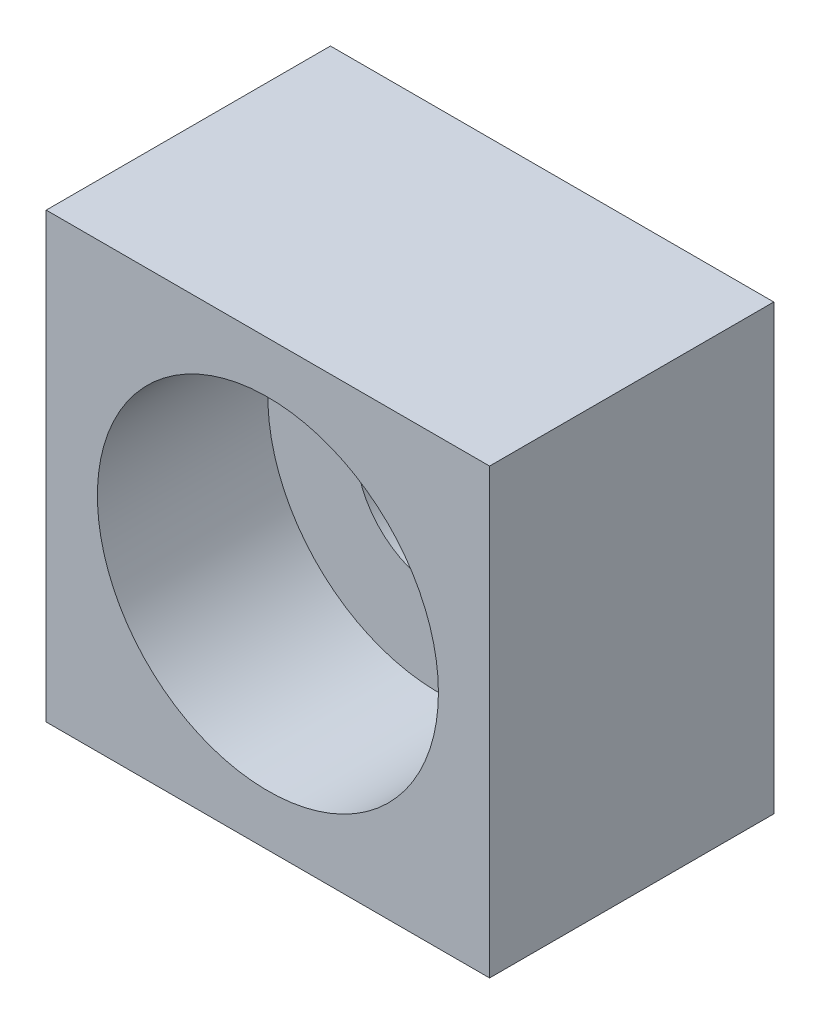
ISO-10303-21;
HEADER;
FILE_DESCRIPTION(('STEP AP214'),'2;1');
FILE_NAME('part.step','',(''),(''),'','','');
FILE_SCHEMA(('AUTOMOTIVE_DESIGN { 1 0 10303 214 1 1 1 1 }'));
ENDSEC;
DATA;
#1=APPLICATION_CONTEXT('core data for automotive mechanical design processes');
#2=APPLICATION_PROTOCOL_DEFINITION('international standard','automotive_design',2000,#1);
#3=PRODUCT_CONTEXT('',#1,'mechanical');
#4=PRODUCT('Part','Part','',(#3));
#5=PRODUCT_RELATED_PRODUCT_CATEGORY('part','',(#4));
#6=PRODUCT_DEFINITION_FORMATION('','',#4);
#7=PRODUCT_DEFINITION_CONTEXT('part definition',#1,'design');
#8=PRODUCT_DEFINITION('design','',#6,#7);
#9=PRODUCT_DEFINITION_SHAPE('','',#8);
#10=(LENGTH_UNIT() NAMED_UNIT(*) SI_UNIT(.MILLI.,.METRE.));
#11=(NAMED_UNIT(*) PLANE_ANGLE_UNIT() SI_UNIT($,.RADIAN.));
#12=(NAMED_UNIT(*) SI_UNIT($,.STERADIAN.) SOLID_ANGLE_UNIT());
#13=UNCERTAINTY_MEASURE_WITH_UNIT(LENGTH_MEASURE(1.E-05),#10,'distance_accuracy_value','');
#14=(GEOMETRIC_REPRESENTATION_CONTEXT(3) GLOBAL_UNCERTAINTY_ASSIGNED_CONTEXT((#13)) GLOBAL_UNIT_ASSIGNED_CONTEXT((#10,
#11,#12)) REPRESENTATION_CONTEXT('',''));
#15=CARTESIAN_POINT('',(0.,0.,0.));
#16=DIRECTION('',(0.,0.,1.));
#17=DIRECTION('',(1.,0.,0.));
#18=AXIS2_PLACEMENT_3D('',#15,#16,#17);
#19=CARTESIAN_POINT('',(0.,0.,5.));
#20=DIRECTION('',(0.,0.,-1.));
#21=DIRECTION('',(-1.,0.,0.));
#22=AXIS2_PLACEMENT_3D('',#19,#20,#21);
#23=CYLINDRICAL_SURFACE('',#22,1.45);
#24=CARTESIAN_POINT('',(0.,0.,0.));
#25=DIRECTION('',(0.,0.,1.));
#26=DIRECTION('',(1.,0.,0.));
#27=AXIS2_PLACEMENT_3D('',#24,#25,#26);
#28=CIRCLE('',#27,1.45);
#29=CARTESIAN_POINT('',(1.45,0.,0.));
#30=VERTEX_POINT('',#29);
#31=EDGE_CURVE('E110',#30,#30,#28,.T.);
#32=ORIENTED_EDGE('',*,*,#31,.F.);
#33=EDGE_LOOP('',(#32));
#34=FACE_BOUND('',#33,.T.);
#35=CARTESIAN_POINT('',(0.,0.,2.));
#36=DIRECTION('',(0.,0.,1.));
#37=DIRECTION('',(1.,0.,0.));
#38=AXIS2_PLACEMENT_3D('',#35,#36,#37);
#39=CIRCLE('',#38,1.45);
#40=CARTESIAN_POINT('',(1.45,0.,2.));
#41=VERTEX_POINT('',#40);
#42=EDGE_CURVE('E45',#41,#41,#39,.T.);
#43=ORIENTED_EDGE('',*,*,#42,.T.);
#44=EDGE_LOOP('',(#43));
#45=FACE_BOUND('',#44,.T.);
#46=ADVANCED_FACE('F41',(#34,#45),#23,.F.);
#47=CARTESIAN_POINT('',(0.,0.,5.));
#48=DIRECTION('',(0.,0.,-1.));
#49=DIRECTION('',(-1.,0.,0.));
#50=AXIS2_PLACEMENT_3D('',#47,#48,#49);
#51=PLANE('',#50);
#52=CARTESIAN_POINT('',(0.,0.,5.));
#53=DIRECTION('',(0.,0.,1.));
#54=DIRECTION('',(1.,0.,0.));
#55=AXIS2_PLACEMENT_3D('',#52,#53,#54);
#56=CIRCLE('',#55,3.);
#57=CARTESIAN_POINT('',(3.,0.,5.));
#58=VERTEX_POINT('',#57);
#59=EDGE_CURVE('E124',#58,#58,#56,.T.);
#60=ORIENTED_EDGE('',*,*,#59,.F.);
#61=EDGE_LOOP('',(#60));
#62=FACE_BOUND('',#61,.T.);
#63=DIRECTION('',(0.,1.,0.));
#64=VECTOR('',#63,1.);
#65=CARTESIAN_POINT('',(3.9,-3.9,5.));
#66=LINE('',#65,#64);
#67=CARTESIAN_POINT('',(3.9,-3.9,5.));
#68=VERTEX_POINT('',#67);
#69=CARTESIAN_POINT('',(3.9,3.9,5.));
#70=VERTEX_POINT('',#69);
#71=EDGE_CURVE('E94',#68,#70,#66,.T.);
#72=ORIENTED_EDGE('',*,*,#71,.T.);
#73=DIRECTION('',(-1.,0.,0.));
#74=VECTOR('',#73,1.);
#75=CARTESIAN_POINT('',(-3.9,3.9,5.));
#76=LINE('',#75,#74);
#77=CARTESIAN_POINT('',(-3.9,3.9,5.));
#78=VERTEX_POINT('',#77);
#79=EDGE_CURVE('E89',#70,#78,#76,.T.);
#80=ORIENTED_EDGE('',*,*,#79,.T.);
#81=DIRECTION('',(0.,-1.,0.));
#82=VECTOR('',#81,1.);
#83=CARTESIAN_POINT('',(-3.9,-3.9,5.));
#84=LINE('',#83,#82);
#85=CARTESIAN_POINT('',(-3.9,-3.9,5.));
#86=VERTEX_POINT('',#85);
#87=EDGE_CURVE('E92',#78,#86,#84,.T.);
#88=ORIENTED_EDGE('',*,*,#87,.T.);
#89=DIRECTION('',(1.,0.,0.));
#90=VECTOR('',#89,1.);
#91=CARTESIAN_POINT('',(-3.9,-3.9,5.));
#92=LINE('',#91,#90);
#93=EDGE_CURVE('E59',#86,#68,#92,.T.);
#94=ORIENTED_EDGE('',*,*,#93,.T.);
#95=EDGE_LOOP('',(#72,#80,#88,#94));
#96=FACE_BOUND('',#95,.T.);
#97=ADVANCED_FACE('F90',(#62,#96),#51,.F.);
#98=CARTESIAN_POINT('',(0.,0.,0.));
#99=DIRECTION('',(0.,0.,-1.));
#100=DIRECTION('',(-1.,0.,0.));
#101=AXIS2_PLACEMENT_3D('',#98,#99,#100);
#102=PLANE('',#101);
#103=DIRECTION('',(0.,1.,0.));
#104=VECTOR('',#103,1.);
#105=CARTESIAN_POINT('',(3.9,-3.9,0.));
#106=LINE('',#105,#104);
#107=CARTESIAN_POINT('',(3.9,-3.9,0.));
#108=VERTEX_POINT('',#107);
#109=CARTESIAN_POINT('',(3.9,3.9,0.));
#110=VERTEX_POINT('',#109);
#111=EDGE_CURVE('E107',#108,#110,#106,.T.);
#112=ORIENTED_EDGE('',*,*,#111,.F.);
#113=DIRECTION('',(1.,0.,0.));
#114=VECTOR('',#113,1.);
#115=CARTESIAN_POINT('',(-3.9,-3.9,0.));
#116=LINE('',#115,#114);
#117=CARTESIAN_POINT('',(-3.9,-3.9,0.));
#118=VERTEX_POINT('',#117);
#119=EDGE_CURVE('E82',#118,#108,#116,.T.);
#120=ORIENTED_EDGE('',*,*,#119,.F.);
#121=DIRECTION('',(0.,-1.,0.));
#122=VECTOR('',#121,1.);
#123=CARTESIAN_POINT('',(-3.9,-3.9,0.));
#124=LINE('',#123,#122);
#125=CARTESIAN_POINT('',(-3.9,3.9,0.));
#126=VERTEX_POINT('',#125);
#127=EDGE_CURVE('E76',#126,#118,#124,.T.);
#128=ORIENTED_EDGE('',*,*,#127,.F.);
#129=DIRECTION('',(-1.,0.,0.));
#130=VECTOR('',#129,1.);
#131=CARTESIAN_POINT('',(-3.9,3.9,0.));
#132=LINE('',#131,#130);
#133=EDGE_CURVE('E98',#110,#126,#132,.T.);
#134=ORIENTED_EDGE('',*,*,#133,.F.);
#135=EDGE_LOOP('',(#112,#120,#128,#134));
#136=FACE_BOUND('',#135,.T.);
#137=ORIENTED_EDGE('',*,*,#31,.T.);
#138=EDGE_LOOP('',(#137));
#139=FACE_BOUND('',#138,.T.);
#140=ADVANCED_FACE('F118',(#136,#139),#102,.T.);
#141=CARTESIAN_POINT('',(3.9,-3.9,5.));
#142=DIRECTION('',(-1.,0.,0.));
#143=DIRECTION('',(0.,0.,1.));
#144=AXIS2_PLACEMENT_3D('',#141,#142,#143);
#145=PLANE('',#144);
#146=ORIENTED_EDGE('',*,*,#111,.T.);
#147=DIRECTION('',(0.,0.,-1.));
#148=VECTOR('',#147,1.);
#149=CARTESIAN_POINT('',(3.9,3.9,5.));
#150=LINE('',#149,#148);
#151=EDGE_CURVE('E11',#70,#110,#150,.T.);
#152=ORIENTED_EDGE('',*,*,#151,.F.);
#153=ORIENTED_EDGE('',*,*,#71,.F.);
#154=DIRECTION('',(0.,0.,-1.));
#155=VECTOR('',#154,1.);
#156=CARTESIAN_POINT('',(3.9,-3.9,5.));
#157=LINE('',#156,#155);
#158=EDGE_CURVE('E103',#68,#108,#157,.T.);
#159=ORIENTED_EDGE('',*,*,#158,.T.);
#160=EDGE_LOOP('',(#146,#152,#153,#159));
#161=FACE_BOUND('',#160,.T.);
#162=ADVANCED_FACE('F43',(#161),#145,.F.);
#163=CARTESIAN_POINT('',(-3.9,3.9,5.));
#164=DIRECTION('',(0.,-1.,0.));
#165=DIRECTION('',(0.,0.,-1.));
#166=AXIS2_PLACEMENT_3D('',#163,#164,#165);
#167=PLANE('',#166);
#168=ORIENTED_EDGE('',*,*,#133,.T.);
#169=DIRECTION('',(0.,0.,-1.));
#170=VECTOR('',#169,1.);
#171=CARTESIAN_POINT('',(-3.9,3.9,5.));
#172=LINE('',#171,#170);
#173=EDGE_CURVE('E51',#78,#126,#172,.T.);
#174=ORIENTED_EDGE('',*,*,#173,.F.);
#175=ORIENTED_EDGE('',*,*,#79,.F.);
#176=ORIENTED_EDGE('',*,*,#151,.T.);
#177=EDGE_LOOP('',(#168,#174,#175,#176));
#178=FACE_BOUND('',#177,.T.);
#179=ADVANCED_FACE('F97',(#178),#167,.F.);
#180=CARTESIAN_POINT('',(-3.9,-3.9,5.));
#181=DIRECTION('',(1.,0.,0.));
#182=DIRECTION('',(0.,0.,-1.));
#183=AXIS2_PLACEMENT_3D('',#180,#181,#182);
#184=PLANE('',#183);
#185=ORIENTED_EDGE('',*,*,#127,.T.);
#186=DIRECTION('',(0.,0.,-1.));
#187=VECTOR('',#186,1.);
#188=CARTESIAN_POINT('',(-3.9,-3.9,5.));
#189=LINE('',#188,#187);
#190=EDGE_CURVE('E99',#86,#118,#189,.T.);
#191=ORIENTED_EDGE('',*,*,#190,.F.);
#192=ORIENTED_EDGE('',*,*,#87,.F.);
#193=ORIENTED_EDGE('',*,*,#173,.T.);
#194=EDGE_LOOP('',(#185,#191,#192,#193));
#195=FACE_BOUND('',#194,.T.);
#196=ADVANCED_FACE('F101',(#195),#184,.F.);
#197=CARTESIAN_POINT('',(-3.9,-3.9,5.));
#198=DIRECTION('',(0.,1.,0.));
#199=DIRECTION('',(0.,0.,1.));
#200=AXIS2_PLACEMENT_3D('',#197,#198,#199);
#201=PLANE('',#200);
#202=ORIENTED_EDGE('',*,*,#119,.T.);
#203=ORIENTED_EDGE('',*,*,#158,.F.);
#204=ORIENTED_EDGE('',*,*,#93,.F.);
#205=ORIENTED_EDGE('',*,*,#190,.T.);
#206=EDGE_LOOP('',(#202,#203,#204,#205));
#207=FACE_BOUND('',#206,.T.);
#208=ADVANCED_FACE('F115',(#207),#201,.F.);
#209=CARTESIAN_POINT('',(0.,0.,2.));
#210=DIRECTION('',(0.,0.,1.));
#211=DIRECTION('',(1.,0.,0.));
#212=AXIS2_PLACEMENT_3D('',#209,#210,#211);
#213=CYLINDRICAL_SURFACE('',#212,3.);
#214=CARTESIAN_POINT('',(0.,0.,2.));
#215=DIRECTION('',(0.,0.,1.));
#216=DIRECTION('',(1.,0.,0.));
#217=AXIS2_PLACEMENT_3D('',#214,#215,#216);
#218=CIRCLE('',#217,3.);
#219=CARTESIAN_POINT('',(3.,0.,2.));
#220=VERTEX_POINT('',#219);
#221=EDGE_CURVE('E127',#220,#220,#218,.T.);
#222=ORIENTED_EDGE('',*,*,#221,.F.);
#223=EDGE_LOOP('',(#222));
#224=FACE_BOUND('',#223,.T.);
#225=ORIENTED_EDGE('',*,*,#59,.T.);
#226=EDGE_LOOP('',(#225));
#227=FACE_BOUND('',#226,.T.);
#228=ADVANCED_FACE('F137',(#224,#227),#213,.F.);
#229=CARTESIAN_POINT('',(0.,0.,2.));
#230=DIRECTION('',(0.,0.,1.));
#231=DIRECTION('',(1.,0.,0.));
#232=AXIS2_PLACEMENT_3D('',#229,#230,#231);
#233=PLANE('',#232);
#234=ORIENTED_EDGE('',*,*,#42,.F.);
#235=EDGE_LOOP('',(#234));
#236=FACE_BOUND('',#235,.T.);
#237=ORIENTED_EDGE('',*,*,#221,.T.);
#238=EDGE_LOOP('',(#237));
#239=FACE_BOUND('',#238,.T.);
#240=ADVANCED_FACE('F135',(#236,#239),#233,.T.);
#241=CLOSED_SHELL('',(#46,#97,#140,#162,#179,#196,#208,#228,#240));
#242=MANIFOLD_SOLID_BREP('B2',#241);
#243=ADVANCED_BREP_SHAPE_REPRESENTATION('',(#18,#242),#14);
#244=SHAPE_DEFINITION_REPRESENTATION(#9,#243);
ENDSEC;
END-ISO-10303-21;
